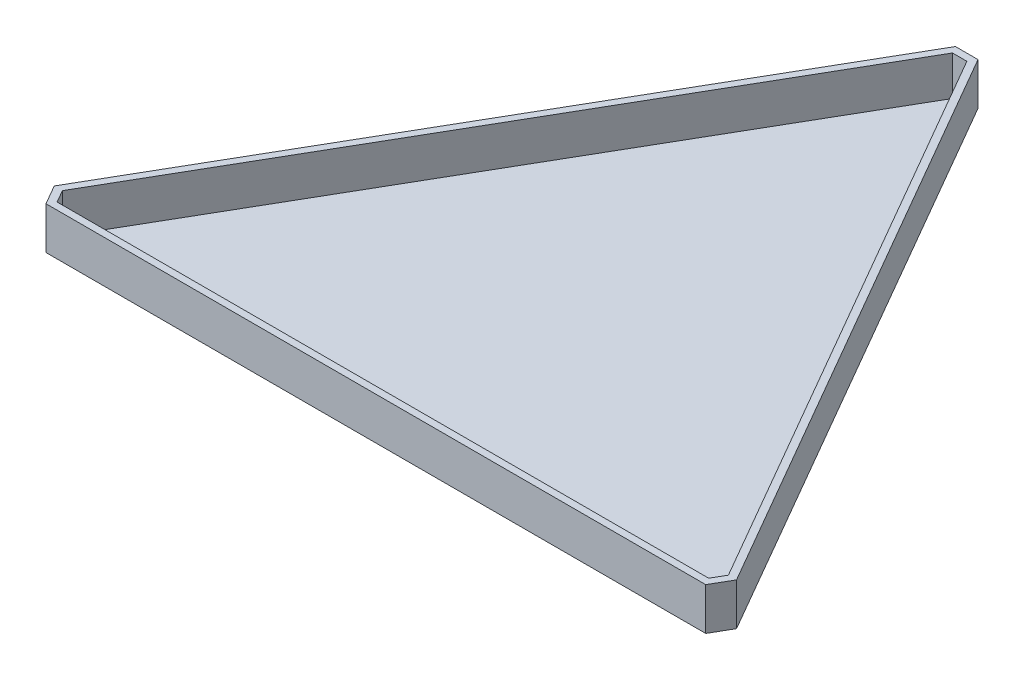
ISO-10303-21;
HEADER;
FILE_DESCRIPTION(('STEP AP214'),'2;1');
FILE_NAME('part.step','',(''),(''),'','','');
FILE_SCHEMA(('AUTOMOTIVE_DESIGN { 1 0 10303 214 1 1 1 1 }'));
ENDSEC;
DATA;
#1=APPLICATION_CONTEXT('core data for automotive mechanical design processes');
#2=APPLICATION_PROTOCOL_DEFINITION('international standard','automotive_design',2000,#1);
#3=PRODUCT_CONTEXT('',#1,'mechanical');
#4=PRODUCT('Part','Part','',(#3));
#5=PRODUCT_RELATED_PRODUCT_CATEGORY('part','',(#4));
#6=PRODUCT_DEFINITION_FORMATION('','',#4);
#7=PRODUCT_DEFINITION_CONTEXT('part definition',#1,'design');
#8=PRODUCT_DEFINITION('design','',#6,#7);
#9=PRODUCT_DEFINITION_SHAPE('','',#8);
#10=(LENGTH_UNIT() NAMED_UNIT(*) SI_UNIT(.MILLI.,.METRE.));
#11=(NAMED_UNIT(*) PLANE_ANGLE_UNIT() SI_UNIT($,.RADIAN.));
#12=(NAMED_UNIT(*) SI_UNIT($,.STERADIAN.) SOLID_ANGLE_UNIT());
#13=UNCERTAINTY_MEASURE_WITH_UNIT(LENGTH_MEASURE(1.E-05),#10,'distance_accuracy_value','');
#14=(GEOMETRIC_REPRESENTATION_CONTEXT(3) GLOBAL_UNCERTAINTY_ASSIGNED_CONTEXT((#13)) GLOBAL_UNIT_ASSIGNED_CONTEXT((#10,
#11,#12)) REPRESENTATION_CONTEXT('',''));
#15=CARTESIAN_POINT('',(0.,0.,0.));
#16=DIRECTION('',(0.,0.,1.));
#17=DIRECTION('',(1.,0.,0.));
#18=AXIS2_PLACEMENT_3D('',#15,#16,#17);
#19=CARTESIAN_POINT('',(0.,0.999999999999997,0.));
#20=DIRECTION('',(0.,-1.,0.));
#21=DIRECTION('',(0.,0.,-1.));
#22=AXIS2_PLACEMENT_3D('',#19,#20,#21);
#23=PLANE('',#22);
#24=DIRECTION('',(0.500000615443151,0.,-0.866025048457878));
#25=VECTOR('',#24,1.);
#26=CARTESIAN_POINT('',(229.159432537699,0.999999999999997,134.98424917793));
#27=LINE('',#26,#25);
#28=CARTESIAN_POINT('',(229.159432537699,0.999999999999997,134.98424917793));
#29=VERTEX_POINT('',#28);
#30=CARTESIAN_POINT('',(344.716133219392,0.999999999999997,-65.1654990754789));
#31=VERTEX_POINT('',#30);
#32=EDGE_CURVE('E205',#29,#31,#27,.T.);
#33=ORIENTED_EDGE('',*,*,#32,.F.);
#34=DIRECTION('',(0.500096079814934,0.,0.865969924970686));
#35=VECTOR('',#34,1.);
#36=CARTESIAN_POINT('',(229.159432537699,0.999999999999997,134.98424917793));
#37=LINE('',#36,#35);
#38=CARTESIAN_POINT('',(231.716666588101,0.999999999999997,139.412373828656));
#39=VERTEX_POINT('',#38);
#40=EDGE_CURVE('E11',#29,#39,#37,.T.);
#41=ORIENTED_EDGE('',*,*,#40,.T.);
#42=DIRECTION('',(1.,0.,0.));
#43=VECTOR('',#42,1.);
#44=CARTESIAN_POINT('',(231.716666588101,0.999999999999997,139.412373828656));
#45=LINE('',#44,#43);
#46=CARTESIAN_POINT('',(462.829865412036,0.999999999999997,139.412373828656));
#47=VERTEX_POINT('',#46);
#48=EDGE_CURVE('E41',#39,#47,#45,.T.);
#49=ORIENTED_EDGE('',*,*,#48,.T.);
#50=DIRECTION('',(0.500000000000011,0.,-0.866025403784432));
#51=VECTOR('',#50,1.);
#52=CARTESIAN_POINT('',(462.829865412036,0.999999999999997,139.412373828656));
#53=LINE('',#52,#51);
#54=CARTESIAN_POINT('',(465.386248749909,0.999999999999997,134.984588003837));
#55=VERTEX_POINT('',#54);
#56=EDGE_CURVE('E210',#47,#55,#53,.T.);
#57=ORIENTED_EDGE('',*,*,#56,.T.);
#58=DIRECTION('',(-0.499999999999987,0.,-0.866025403784446));
#59=VECTOR('',#58,1.);
#60=CARTESIAN_POINT('',(465.386248749909,0.999999999999997,134.984588003837));
#61=LINE('',#60,#59);
#62=CARTESIAN_POINT('',(349.829542096343,0.999999999999997,-65.1654990754789));
#63=VERTEX_POINT('',#62);
#64=EDGE_CURVE('E208',#55,#63,#61,.T.);
#65=ORIENTED_EDGE('',*,*,#64,.T.);
#66=DIRECTION('',(1.,0.,0.));
#67=VECTOR('',#66,1.);
#68=CARTESIAN_POINT('',(344.716133219392,0.999999999999997,-65.1654990754789));
#69=LINE('',#68,#67);
#70=EDGE_CURVE('E56',#31,#63,#69,.T.);
#71=ORIENTED_EDGE('',*,*,#70,.F.);
#72=EDGE_LOOP('',(#33,#41,#49,#57,#65,#71));
#73=FACE_BOUND('',#72,.T.);
#74=ADVANCED_FACE('F33',(#73),#23,.F.);
#75=CARTESIAN_POINT('',(465.386248749909,15.,134.984588003837));
#76=DIRECTION('',(-0.866025403784446,0.,0.499999999999988));
#77=DIRECTION('',(0.499999999999988,0.,0.866025403784446));
#78=AXIS2_PLACEMENT_3D('',#75,#76,#77);
#79=PLANE('',#78);
#80=ORIENTED_EDGE('',*,*,#64,.F.);
#81=DIRECTION('',(0.,-1.,0.));
#82=VECTOR('',#81,1.);
#83=CARTESIAN_POINT('',(465.386248749909,15.,134.984588003837));
#84=LINE('',#83,#82);
#85=CARTESIAN_POINT('',(465.386248749909,15.,134.984588003837));
#86=VERTEX_POINT('',#85);
#87=EDGE_CURVE('E48',#86,#55,#84,.T.);
#88=ORIENTED_EDGE('',*,*,#87,.F.);
#89=DIRECTION('',(-0.499999999999987,0.,-0.866025403784446));
#90=VECTOR('',#89,1.);
#91=CARTESIAN_POINT('',(465.386248749909,15.,134.984588003837));
#92=LINE('',#91,#90);
#93=CARTESIAN_POINT('',(349.829542096343,15.,-65.1654990754789));
#94=VERTEX_POINT('',#93);
#95=EDGE_CURVE('E123',#86,#94,#92,.T.);
#96=ORIENTED_EDGE('',*,*,#95,.T.);
#97=DIRECTION('',(0.,-1.,0.));
#98=VECTOR('',#97,1.);
#99=CARTESIAN_POINT('',(349.829542096343,15.,-65.1654990754789));
#100=LINE('',#99,#98);
#101=EDGE_CURVE('E125',#94,#63,#100,.T.);
#102=ORIENTED_EDGE('',*,*,#101,.T.);
#103=EDGE_LOOP('',(#80,#88,#96,#102));
#104=FACE_BOUND('',#103,.T.);
#105=ADVANCED_FACE('F124',(#104),#79,.T.);
#106=CARTESIAN_POINT('',(344.716133219392,15.,-65.1654990754789));
#107=DIRECTION('',(0.,0.,1.));
#108=DIRECTION('',(1.,0.,0.));
#109=AXIS2_PLACEMENT_3D('',#106,#107,#108);
#110=PLANE('',#109);
#111=ORIENTED_EDGE('',*,*,#70,.T.);
#112=ORIENTED_EDGE('',*,*,#101,.F.);
#113=DIRECTION('',(-1.,0.,0.));
#114=VECTOR('',#113,1.);
#115=CARTESIAN_POINT('',(344.716133219392,15.,-65.1654990754789));
#116=LINE('',#115,#114);
#117=CARTESIAN_POINT('',(344.716133219392,15.,-65.1654990754789));
#118=VERTEX_POINT('',#117);
#119=EDGE_CURVE('E130',#94,#118,#116,.T.);
#120=ORIENTED_EDGE('',*,*,#119,.T.);
#121=DIRECTION('',(0.,-1.,0.));
#122=VECTOR('',#121,1.);
#123=CARTESIAN_POINT('',(344.716133219392,15.,-65.1654990754789));
#124=LINE('',#123,#122);
#125=EDGE_CURVE('E135',#118,#31,#124,.T.);
#126=ORIENTED_EDGE('',*,*,#125,.T.);
#127=EDGE_LOOP('',(#111,#112,#120,#126));
#128=FACE_BOUND('',#127,.T.);
#129=ADVANCED_FACE('F132',(#128),#110,.T.);
#130=CARTESIAN_POINT('',(229.159432537699,15.,134.98424917793));
#131=DIRECTION('',(0.866025048457878,0.,0.500000615443151));
#132=DIRECTION('',(0.500000615443151,0.,-0.866025048457878));
#133=AXIS2_PLACEMENT_3D('',#130,#131,#132);
#134=PLANE('',#133);
#135=ORIENTED_EDGE('',*,*,#32,.T.);
#136=ORIENTED_EDGE('',*,*,#125,.F.);
#137=DIRECTION('',(-0.500000615443151,0.,0.866025048457878));
#138=VECTOR('',#137,1.);
#139=CARTESIAN_POINT('',(229.159432537699,15.,134.98424917793));
#140=LINE('',#139,#138);
#141=CARTESIAN_POINT('',(229.159432537699,15.,134.98424917793));
#142=VERTEX_POINT('',#141);
#143=EDGE_CURVE('E140',#118,#142,#140,.T.);
#144=ORIENTED_EDGE('',*,*,#143,.T.);
#145=DIRECTION('',(0.,-1.,0.));
#146=VECTOR('',#145,1.);
#147=CARTESIAN_POINT('',(229.159432537699,15.,134.98424917793));
#148=LINE('',#147,#146);
#149=EDGE_CURVE('E158',#142,#29,#148,.T.);
#150=ORIENTED_EDGE('',*,*,#149,.T.);
#151=EDGE_LOOP('',(#135,#136,#144,#150));
#152=FACE_BOUND('',#151,.T.);
#153=ADVANCED_FACE('F264',(#152),#134,.T.);
#154=CARTESIAN_POINT('',(229.159432537699,15.,134.98424917793));
#155=DIRECTION('',(0.865969924970686,0.,-0.500096079814934));
#156=DIRECTION('',(-0.500096079814934,0.,-0.865969924970686));
#157=AXIS2_PLACEMENT_3D('',#154,#155,#156);
#158=PLANE('',#157);
#159=ORIENTED_EDGE('',*,*,#40,.F.);
#160=ORIENTED_EDGE('',*,*,#149,.F.);
#161=DIRECTION('',(0.500096079814934,0.,0.865969924970686));
#162=VECTOR('',#161,1.);
#163=CARTESIAN_POINT('',(229.159432537699,15.,134.98424917793));
#164=LINE('',#163,#162);
#165=CARTESIAN_POINT('',(231.716666588101,15.,139.412373828656));
#166=VERTEX_POINT('',#165);
#167=EDGE_CURVE('E142',#142,#166,#164,.T.);
#168=ORIENTED_EDGE('',*,*,#167,.T.);
#169=DIRECTION('',(0.,-1.,0.));
#170=VECTOR('',#169,1.);
#171=CARTESIAN_POINT('',(231.716666588101,15.,139.412373828656));
#172=LINE('',#171,#170);
#173=EDGE_CURVE('E155',#166,#39,#172,.T.);
#174=ORIENTED_EDGE('',*,*,#173,.T.);
#175=EDGE_LOOP('',(#159,#160,#168,#174));
#176=FACE_BOUND('',#175,.T.);
#177=ADVANCED_FACE('F220',(#176),#158,.T.);
#178=CARTESIAN_POINT('',(231.716666588101,15.,139.412373828656));
#179=DIRECTION('',(0.,0.,-1.));
#180=DIRECTION('',(-1.,0.,0.));
#181=AXIS2_PLACEMENT_3D('',#178,#179,#180);
#182=PLANE('',#181);
#183=ORIENTED_EDGE('',*,*,#48,.F.);
#184=ORIENTED_EDGE('',*,*,#173,.F.);
#185=DIRECTION('',(1.,0.,0.));
#186=VECTOR('',#185,1.);
#187=CARTESIAN_POINT('',(231.716666588101,15.,139.412373828656));
#188=LINE('',#187,#186);
#189=CARTESIAN_POINT('',(462.829865412036,15.,139.412373828656));
#190=VERTEX_POINT('',#189);
#191=EDGE_CURVE('E146',#166,#190,#188,.T.);
#192=ORIENTED_EDGE('',*,*,#191,.T.);
#193=DIRECTION('',(0.,-1.,0.));
#194=VECTOR('',#193,1.);
#195=CARTESIAN_POINT('',(462.829865412036,15.,139.412373828656));
#196=LINE('',#195,#194);
#197=EDGE_CURVE('E152',#190,#47,#196,.T.);
#198=ORIENTED_EDGE('',*,*,#197,.T.);
#199=EDGE_LOOP('',(#183,#184,#192,#198));
#200=FACE_BOUND('',#199,.T.);
#201=ADVANCED_FACE('F217',(#200),#182,.T.);
#202=CARTESIAN_POINT('',(462.829865412036,15.,139.412373828656));
#203=DIRECTION('',(-0.866025403784432,0.,-0.500000000000011));
#204=DIRECTION('',(-0.500000000000011,0.,0.866025403784432));
#205=AXIS2_PLACEMENT_3D('',#202,#203,#204);
#206=PLANE('',#205);
#207=ORIENTED_EDGE('',*,*,#56,.F.);
#208=ORIENTED_EDGE('',*,*,#197,.F.);
#209=DIRECTION('',(0.500000000000011,0.,-0.866025403784432));
#210=VECTOR('',#209,1.);
#211=CARTESIAN_POINT('',(462.829865412036,15.,139.412373828656));
#212=LINE('',#211,#210);
#213=EDGE_CURVE('E149',#190,#86,#212,.T.);
#214=ORIENTED_EDGE('',*,*,#213,.T.);
#215=ORIENTED_EDGE('',*,*,#87,.T.);
#216=EDGE_LOOP('',(#207,#208,#214,#215));
#217=FACE_BOUND('',#216,.T.);
#218=ADVANCED_FACE('F222',(#217),#206,.T.);
#219=CARTESIAN_POINT('',(0.,15.,0.));
#220=DIRECTION('',(0.,-1.,0.));
#221=DIRECTION('',(0.,0.,-1.));
#222=AXIS2_PLACEMENT_3D('',#219,#220,#221);
#223=PLANE('',#222);
#224=DIRECTION('',(1.,0.,0.));
#225=VECTOR('',#224,1.);
#226=CARTESIAN_POINT('',(230.273290915127,15.,141.912373828656));
#227=LINE('',#226,#225);
#228=CARTESIAN_POINT('',(230.273290915127,15.,141.912373828656));
#229=VERTEX_POINT('',#228);
#230=CARTESIAN_POINT('',(464.27324108501,15.,141.912373828656));
#231=VERTEX_POINT('',#230);
#232=EDGE_CURVE('E162',#229,#231,#227,.T.);
#233=ORIENTED_EDGE('',*,*,#232,.T.);
#234=DIRECTION('',(0.500000000000019,0.,-0.866025403784428));
#235=VECTOR('',#234,1.);
#236=CARTESIAN_POINT('',(468.273000095857,15.,134.984588003837));
#237=LINE('',#236,#235);
#238=CARTESIAN_POINT('',(468.273000095857,15.,134.984588003837));
#239=VERTEX_POINT('',#238);
#240=EDGE_CURVE('E165',#231,#239,#237,.T.);
#241=ORIENTED_EDGE('',*,*,#240,.T.);
#242=DIRECTION('',(-0.499999999999987,0.,-0.866025403784446));
#243=VECTOR('',#242,1.);
#244=CARTESIAN_POINT('',(351.272917769317,15.,-67.6654990754789));
#245=LINE('',#244,#243);
#246=CARTESIAN_POINT('',(351.272917769317,15.,-67.6654990754789));
#247=VERTEX_POINT('',#246);
#248=EDGE_CURVE('E168',#239,#247,#245,.T.);
#249=ORIENTED_EDGE('',*,*,#248,.T.);
#250=DIRECTION('',(-1.,0.,0.));
#251=VECTOR('',#250,1.);
#252=CARTESIAN_POINT('',(343.272757546418,15.,-67.6654990754789));
#253=LINE('',#252,#251);
#254=CARTESIAN_POINT('',(343.272757546418,15.,-67.6654990754789));
#255=VERTEX_POINT('',#254);
#256=EDGE_CURVE('E170',#247,#255,#253,.T.);
#257=ORIENTED_EDGE('',*,*,#256,.T.);
#258=DIRECTION('',(-0.500000607850711,0.,0.866025052841383));
#259=VECTOR('',#258,1.);
#260=CARTESIAN_POINT('',(226.272682946466,15.,134.984246138676));
#261=LINE('',#260,#259);
#262=CARTESIAN_POINT('',(226.272682946466,15.,134.984246138676));
#263=VERTEX_POINT('',#262);
#264=EDGE_CURVE('E172',#255,#263,#261,.T.);
#265=ORIENTED_EDGE('',*,*,#264,.T.);
#266=DIRECTION('',(0.500061082735036,0.,0.865990134778603));
#267=VECTOR('',#266,1.);
#268=CARTESIAN_POINT('',(230.273290915127,15.,141.912373828656));
#269=LINE('',#268,#267);
#270=EDGE_CURVE('E174',#263,#229,#269,.T.);
#271=ORIENTED_EDGE('',*,*,#270,.T.);
#272=EDGE_LOOP('',(#233,#241,#249,#257,#265,#271));
#273=FACE_BOUND('',#272,.T.);
#274=ORIENTED_EDGE('',*,*,#95,.F.);
#275=ORIENTED_EDGE('',*,*,#213,.F.);
#276=ORIENTED_EDGE('',*,*,#191,.F.);
#277=ORIENTED_EDGE('',*,*,#167,.F.);
#278=ORIENTED_EDGE('',*,*,#143,.F.);
#279=ORIENTED_EDGE('',*,*,#119,.F.);
#280=EDGE_LOOP('',(#274,#275,#276,#277,#278,#279));
#281=FACE_BOUND('',#280,.T.);
#282=ADVANCED_FACE('F138',(#273,#281),#223,.F.);
#283=CARTESIAN_POINT('',(230.273290915127,15.,141.912373828656));
#284=DIRECTION('',(0.,0.,-1.));
#285=DIRECTION('',(-1.,0.,0.));
#286=AXIS2_PLACEMENT_3D('',#283,#284,#285);
#287=PLANE('',#286);
#288=DIRECTION('',(1.,0.,0.));
#289=VECTOR('',#288,1.);
#290=CARTESIAN_POINT('',(230.273290915127,0.,141.912373828656));
#291=LINE('',#290,#289);
#292=CARTESIAN_POINT('',(230.273290915127,0.,141.912373828656));
#293=VERTEX_POINT('',#292);
#294=CARTESIAN_POINT('',(464.27324108501,0.,141.912373828656));
#295=VERTEX_POINT('',#294);
#296=EDGE_CURVE('E134',#293,#295,#291,.T.);
#297=ORIENTED_EDGE('',*,*,#296,.T.);
#298=DIRECTION('',(0.,-1.,0.));
#299=VECTOR('',#298,1.);
#300=CARTESIAN_POINT('',(464.27324108501,15.,141.912373828656));
#301=LINE('',#300,#299);
#302=EDGE_CURVE('E202',#231,#295,#301,.T.);
#303=ORIENTED_EDGE('',*,*,#302,.F.);
#304=ORIENTED_EDGE('',*,*,#232,.F.);
#305=DIRECTION('',(0.,-1.,0.));
#306=VECTOR('',#305,1.);
#307=CARTESIAN_POINT('',(230.273290915127,15.,141.912373828656));
#308=LINE('',#307,#306);
#309=EDGE_CURVE('E176',#229,#293,#308,.T.);
#310=ORIENTED_EDGE('',*,*,#309,.T.);
#311=EDGE_LOOP('',(#297,#303,#304,#310));
#312=FACE_BOUND('',#311,.T.);
#313=ADVANCED_FACE('F229',(#312),#287,.F.);
#314=CARTESIAN_POINT('',(468.273000095857,15.,134.984588003837));
#315=DIRECTION('',(-0.866025403784428,0.,-0.500000000000019));
#316=DIRECTION('',(-0.500000000000019,0.,0.866025403784428));
#317=AXIS2_PLACEMENT_3D('',#314,#315,#316);
#318=PLANE('',#317);
#319=DIRECTION('',(0.500000000000019,0.,-0.866025403784428));
#320=VECTOR('',#319,1.);
#321=CARTESIAN_POINT('',(468.273000095857,0.,134.984588003837));
#322=LINE('',#321,#320);
#323=CARTESIAN_POINT('',(468.273000095857,0.,134.984588003837));
#324=VERTEX_POINT('',#323);
#325=EDGE_CURVE('E179',#295,#324,#322,.T.);
#326=ORIENTED_EDGE('',*,*,#325,.T.);
#327=DIRECTION('',(0.,-1.,0.));
#328=VECTOR('',#327,1.);
#329=CARTESIAN_POINT('',(468.273000095857,15.,134.984588003837));
#330=LINE('',#329,#328);
#331=EDGE_CURVE('E199',#239,#324,#330,.T.);
#332=ORIENTED_EDGE('',*,*,#331,.F.);
#333=ORIENTED_EDGE('',*,*,#240,.F.);
#334=ORIENTED_EDGE('',*,*,#302,.T.);
#335=EDGE_LOOP('',(#326,#332,#333,#334));
#336=FACE_BOUND('',#335,.T.);
#337=ADVANCED_FACE('F241',(#336),#318,.F.);
#338=CARTESIAN_POINT('',(351.272917769317,15.,-67.6654990754789));
#339=DIRECTION('',(-0.866025403784446,0.,0.499999999999988));
#340=DIRECTION('',(0.499999999999988,0.,0.866025403784446));
#341=AXIS2_PLACEMENT_3D('',#338,#339,#340);
#342=PLANE('',#341);
#343=DIRECTION('',(-0.499999999999987,0.,-0.866025403784446));
#344=VECTOR('',#343,1.);
#345=CARTESIAN_POINT('',(351.272917769317,0.,-67.6654990754789));
#346=LINE('',#345,#344);
#347=CARTESIAN_POINT('',(351.272917769317,0.,-67.6654990754789));
#348=VERTEX_POINT('',#347);
#349=EDGE_CURVE('E181',#324,#348,#346,.T.);
#350=ORIENTED_EDGE('',*,*,#349,.T.);
#351=DIRECTION('',(0.,-1.,0.));
#352=VECTOR('',#351,1.);
#353=CARTESIAN_POINT('',(351.272917769317,15.,-67.6654990754789));
#354=LINE('',#353,#352);
#355=EDGE_CURVE('E196',#247,#348,#354,.T.);
#356=ORIENTED_EDGE('',*,*,#355,.F.);
#357=ORIENTED_EDGE('',*,*,#248,.F.);
#358=ORIENTED_EDGE('',*,*,#331,.T.);
#359=EDGE_LOOP('',(#350,#356,#357,#358));
#360=FACE_BOUND('',#359,.T.);
#361=ADVANCED_FACE('F245',(#360),#342,.F.);
#362=CARTESIAN_POINT('',(343.272757546418,15.,-67.6654990754789));
#363=DIRECTION('',(0.,0.,1.));
#364=DIRECTION('',(1.,0.,0.));
#365=AXIS2_PLACEMENT_3D('',#362,#363,#364);
#366=PLANE('',#365);
#367=DIRECTION('',(-1.,0.,0.));
#368=VECTOR('',#367,1.);
#369=CARTESIAN_POINT('',(343.272757546418,0.,-67.6654990754789));
#370=LINE('',#369,#368);
#371=CARTESIAN_POINT('',(343.272757546418,0.,-67.6654990754789));
#372=VERTEX_POINT('',#371);
#373=EDGE_CURVE('E183',#348,#372,#370,.T.);
#374=ORIENTED_EDGE('',*,*,#373,.T.);
#375=DIRECTION('',(0.,-1.,0.));
#376=VECTOR('',#375,1.);
#377=CARTESIAN_POINT('',(343.272757546418,15.,-67.6654990754789));
#378=LINE('',#377,#376);
#379=EDGE_CURVE('E193',#255,#372,#378,.T.);
#380=ORIENTED_EDGE('',*,*,#379,.F.);
#381=ORIENTED_EDGE('',*,*,#256,.F.);
#382=ORIENTED_EDGE('',*,*,#355,.T.);
#383=EDGE_LOOP('',(#374,#380,#381,#382));
#384=FACE_BOUND('',#383,.T.);
#385=ADVANCED_FACE('F249',(#384),#366,.F.);
#386=CARTESIAN_POINT('',(226.272682946466,15.,134.984246138676));
#387=DIRECTION('',(0.866025052841383,0.,0.500000607850711));
#388=DIRECTION('',(0.500000607850711,0.,-0.866025052841383));
#389=AXIS2_PLACEMENT_3D('',#386,#387,#388);
#390=PLANE('',#389);
#391=DIRECTION('',(-0.500000607850711,0.,0.866025052841383));
#392=VECTOR('',#391,1.);
#393=CARTESIAN_POINT('',(226.272682946466,0.,134.984246138676));
#394=LINE('',#393,#392);
#395=CARTESIAN_POINT('',(226.272682946466,0.,134.984246138676));
#396=VERTEX_POINT('',#395);
#397=EDGE_CURVE('E185',#372,#396,#394,.T.);
#398=ORIENTED_EDGE('',*,*,#397,.T.);
#399=DIRECTION('',(0.,-1.,0.));
#400=VECTOR('',#399,1.);
#401=CARTESIAN_POINT('',(226.272682946466,15.,134.984246138676));
#402=LINE('',#401,#400);
#403=EDGE_CURVE('E190',#263,#396,#402,.T.);
#404=ORIENTED_EDGE('',*,*,#403,.F.);
#405=ORIENTED_EDGE('',*,*,#264,.F.);
#406=ORIENTED_EDGE('',*,*,#379,.T.);
#407=EDGE_LOOP('',(#398,#404,#405,#406));
#408=FACE_BOUND('',#407,.T.);
#409=ADVANCED_FACE('F253',(#408),#390,.F.);
#410=CARTESIAN_POINT('',(230.273290915127,15.,141.912373828656));
#411=DIRECTION('',(0.865990134778603,0.,-0.500061082735036));
#412=DIRECTION('',(-0.500061082735036,0.,-0.865990134778603));
#413=AXIS2_PLACEMENT_3D('',#410,#411,#412);
#414=PLANE('',#413);
#415=DIRECTION('',(0.500061082735036,0.,0.865990134778603));
#416=VECTOR('',#415,1.);
#417=CARTESIAN_POINT('',(230.273290915127,0.,141.912373828656));
#418=LINE('',#417,#416);
#419=EDGE_CURVE('E166',#396,#293,#418,.T.);
#420=ORIENTED_EDGE('',*,*,#419,.T.);
#421=ORIENTED_EDGE('',*,*,#309,.F.);
#422=ORIENTED_EDGE('',*,*,#270,.F.);
#423=ORIENTED_EDGE('',*,*,#403,.T.);
#424=EDGE_LOOP('',(#420,#421,#422,#423));
#425=FACE_BOUND('',#424,.T.);
#426=ADVANCED_FACE('F257',(#425),#414,.F.);
#427=CARTESIAN_POINT('',(0.,0.,0.));
#428=DIRECTION('',(0.,-1.,0.));
#429=DIRECTION('',(0.,0.,-1.));
#430=AXIS2_PLACEMENT_3D('',#427,#428,#429);
#431=PLANE('',#430);
#432=ORIENTED_EDGE('',*,*,#296,.F.);
#433=ORIENTED_EDGE('',*,*,#419,.F.);
#434=ORIENTED_EDGE('',*,*,#397,.F.);
#435=ORIENTED_EDGE('',*,*,#373,.F.);
#436=ORIENTED_EDGE('',*,*,#349,.F.);
#437=ORIENTED_EDGE('',*,*,#325,.F.);
#438=EDGE_LOOP('',(#432,#433,#434,#435,#436,#437));
#439=FACE_BOUND('',#438,.T.);
#440=ADVANCED_FACE('F35',(#439),#431,.T.);
#441=CLOSED_SHELL('',(#74,#105,#129,#153,#177,#201,#218,#282,#313,#337,#361,#385,#409,#426,#440));
#442=MANIFOLD_SOLID_BREP('B2',#441);
#443=ADVANCED_BREP_SHAPE_REPRESENTATION('',(#18,#442),#14);
#444=SHAPE_DEFINITION_REPRESENTATION(#9,#443);
ENDSEC;
END-ISO-10303-21;
